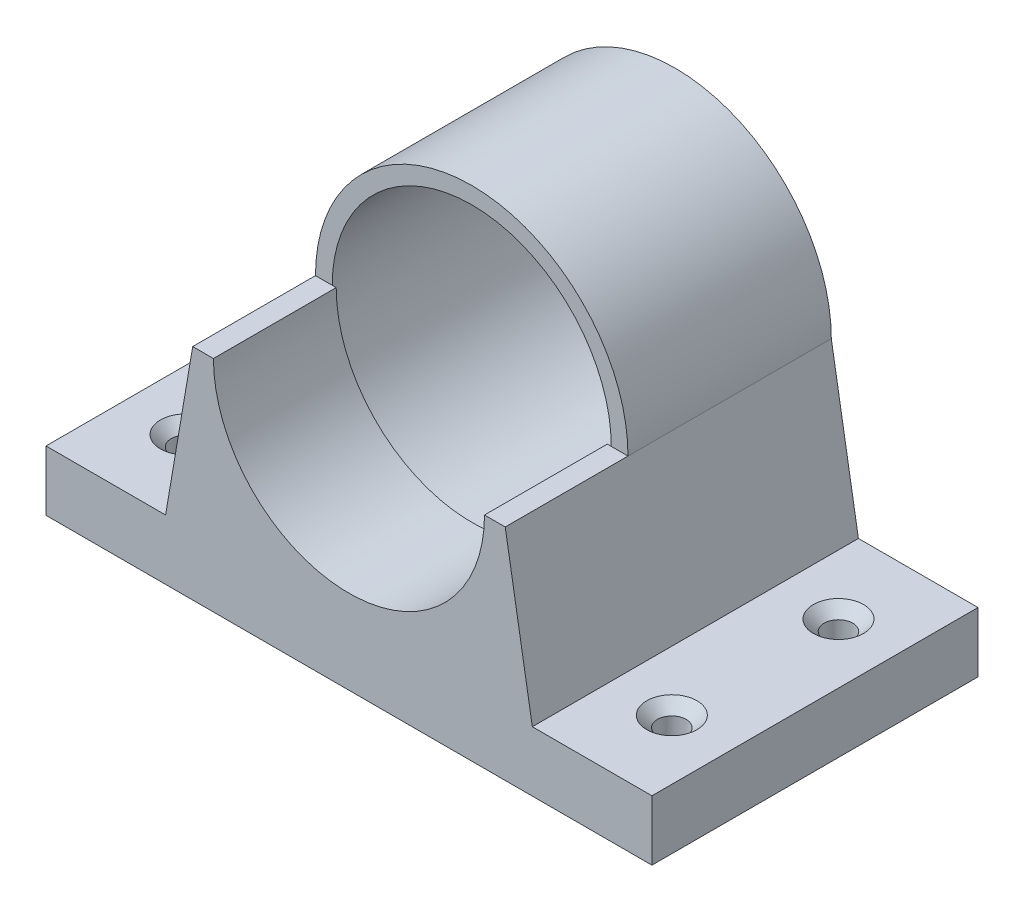
ISO-10303-21;
HEADER;
FILE_DESCRIPTION(('STEP AP214'),'2;1');
FILE_NAME('part.step','',(''),(''),'','','');
FILE_SCHEMA(('AUTOMOTIVE_DESIGN { 1 0 10303 214 1 1 1 1 }'));
ENDSEC;
DATA;
#1=APPLICATION_CONTEXT('core data for automotive mechanical design processes');
#2=APPLICATION_PROTOCOL_DEFINITION('international standard','automotive_design',2000,#1);
#3=PRODUCT_CONTEXT('',#1,'mechanical');
#4=PRODUCT('Part','Part','',(#3));
#5=PRODUCT_RELATED_PRODUCT_CATEGORY('part','',(#4));
#6=PRODUCT_DEFINITION_FORMATION('','',#4);
#7=PRODUCT_DEFINITION_CONTEXT('part definition',#1,'design');
#8=PRODUCT_DEFINITION('design','',#6,#7);
#9=PRODUCT_DEFINITION_SHAPE('','',#8);
#10=(LENGTH_UNIT() NAMED_UNIT(*) SI_UNIT(.MILLI.,.METRE.));
#11=(NAMED_UNIT(*) PLANE_ANGLE_UNIT() SI_UNIT($,.RADIAN.));
#12=(NAMED_UNIT(*) SI_UNIT($,.STERADIAN.) SOLID_ANGLE_UNIT());
#13=UNCERTAINTY_MEASURE_WITH_UNIT(LENGTH_MEASURE(1.E-05),#10,'distance_accuracy_value','');
#14=(GEOMETRIC_REPRESENTATION_CONTEXT(3) GLOBAL_UNCERTAINTY_ASSIGNED_CONTEXT((#13)) GLOBAL_UNIT_ASSIGNED_CONTEXT((#10,
#11,#12)) REPRESENTATION_CONTEXT('',''));
#15=CARTESIAN_POINT('',(0.,0.,0.));
#16=DIRECTION('',(0.,0.,1.));
#17=DIRECTION('',(1.,0.,0.));
#18=AXIS2_PLACEMENT_3D('',#15,#16,#17);
#19=CARTESIAN_POINT('',(0.,18.1533956791324,0.));
#20=DIRECTION('',(0.,0.,-1.));
#21=DIRECTION('',(-1.,0.,0.));
#22=AXIS2_PLACEMENT_3D('',#19,#20,#21);
#23=PLANE('',#22);
#24=CARTESIAN_POINT('',(0.,18.1533956791324,0.));
#25=DIRECTION('',(0.,0.,1.));
#26=DIRECTION('',(1.,0.,0.));
#27=AXIS2_PLACEMENT_3D('',#24,#25,#26);
#28=CIRCLE('',#27,17.5);
#29=CARTESIAN_POINT('',(17.5,18.1533956791324,0.));
#30=VERTEX_POINT('',#29);
#31=CARTESIAN_POINT('',(-17.5,18.1533956791324,0.));
#32=VERTEX_POINT('',#31);
#33=EDGE_CURVE('E332',#30,#32,#28,.T.);
#34=ORIENTED_EDGE('',*,*,#33,.F.);
#35=DIRECTION('',(1.,0.,0.));
#36=VECTOR('',#35,1.);
#37=CARTESIAN_POINT('',(0.,18.1533956791324,0.));
#38=LINE('',#37,#36);
#39=CARTESIAN_POINT('',(19.6,18.1533956791324,0.));
#40=VERTEX_POINT('',#39);
#41=EDGE_CURVE('E210',#30,#40,#38,.T.);
#42=ORIENTED_EDGE('',*,*,#41,.T.);
#43=CARTESIAN_POINT('',(0.,18.1533956791324,0.));
#44=DIRECTION('',(0.,0.,1.));
#45=DIRECTION('',(1.,0.,0.));
#46=AXIS2_PLACEMENT_3D('',#43,#44,#45);
#47=CIRCLE('',#46,19.6);
#48=CARTESIAN_POINT('',(-19.6,18.1533956791324,0.));
#49=VERTEX_POINT('',#48);
#50=EDGE_CURVE('E353',#40,#49,#47,.T.);
#51=ORIENTED_EDGE('',*,*,#50,.T.);
#52=DIRECTION('',(1.,0.,0.));
#53=VECTOR('',#52,1.);
#54=CARTESIAN_POINT('',(0.,18.1533956791324,0.));
#55=LINE('',#54,#53);
#56=EDGE_CURVE('E216',#49,#32,#55,.T.);
#57=ORIENTED_EDGE('',*,*,#56,.T.);
#58=EDGE_LOOP('',(#34,#42,#51,#57));
#59=FACE_BOUND('',#58,.T.);
#60=ADVANCED_FACE('F56',(#59),#23,.F.);
#61=CARTESIAN_POINT('',(0.,18.1533956791324,-25.5));
#62=DIRECTION('',(0.,0.,1.));
#63=DIRECTION('',(1.,0.,0.));
#64=AXIS2_PLACEMENT_3D('',#61,#62,#63);
#65=CYLINDRICAL_SURFACE('',#64,19.6);
#66=DIRECTION('',(0.,0.,-1.));
#67=VECTOR('',#66,1.);
#68=CARTESIAN_POINT('',(-19.6,18.1533956791324,15.4));
#69=LINE('',#68,#67);
#70=CARTESIAN_POINT('',(-19.6,18.1533956791324,-25.5));
#71=VERTEX_POINT('',#70);
#72=EDGE_CURVE('E333',#49,#71,#69,.T.);
#73=ORIENTED_EDGE('',*,*,#72,.F.);
#74=ORIENTED_EDGE('',*,*,#50,.F.);
#75=DIRECTION('',(0.,0.,-1.));
#76=VECTOR('',#75,1.);
#77=CARTESIAN_POINT('',(19.6,18.1533956791324,15.4));
#78=LINE('',#77,#76);
#79=CARTESIAN_POINT('',(19.6,18.1533956791324,-25.5));
#80=VERTEX_POINT('',#79);
#81=EDGE_CURVE('E328',#40,#80,#78,.T.);
#82=ORIENTED_EDGE('',*,*,#81,.T.);
#83=CARTESIAN_POINT('',(0.,18.1533956791324,-25.5));
#84=DIRECTION('',(0.,0.,-1.));
#85=DIRECTION('',(-1.,0.,0.));
#86=AXIS2_PLACEMENT_3D('',#83,#84,#85);
#87=CIRCLE('',#86,19.6);
#88=EDGE_CURVE('E357',#71,#80,#87,.T.);
#89=ORIENTED_EDGE('',*,*,#88,.F.);
#90=EDGE_LOOP('',(#73,#74,#82,#89));
#91=FACE_BOUND('',#90,.T.);
#92=ADVANCED_FACE('F58',(#91),#65,.T.);
#93=CARTESIAN_POINT('',(0.,18.1533956791324,-25.5));
#94=DIRECTION('',(0.,0.,-1.));
#95=DIRECTION('',(-1.,0.,0.));
#96=AXIS2_PLACEMENT_3D('',#93,#94,#95);
#97=PLANE('',#96);
#98=CARTESIAN_POINT('',(0.,18.1533956791324,-25.5));
#99=DIRECTION('',(0.,0.,1.));
#100=DIRECTION('',(1.,0.,0.));
#101=AXIS2_PLACEMENT_3D('',#98,#99,#100);
#102=CIRCLE('',#101,17.5);
#103=CARTESIAN_POINT('',(17.5,18.1533956791324,-25.5));
#104=VERTEX_POINT('',#103);
#105=EDGE_CURVE('E349',#104,#104,#102,.T.);
#106=ORIENTED_EDGE('',*,*,#105,.T.);
#107=EDGE_LOOP('',(#106));
#108=FACE_BOUND('',#107,.T.);
#109=ORIENTED_EDGE('',*,*,#88,.T.);
#110=DIRECTION('',(0.167595493933869,-0.985855846669817,0.));
#111=VECTOR('',#110,1.);
#112=CARTESIAN_POINT('',(19.6,18.1533956791324,-25.5));
#113=LINE('',#112,#111);
#114=CARTESIAN_POINT('',(23.,-1.84660432086758,-25.5));
#115=VERTEX_POINT('',#114);
#116=EDGE_CURVE('E293',#80,#115,#113,.T.);
#117=ORIENTED_EDGE('',*,*,#116,.T.);
#118=DIRECTION('',(1.,0.,0.));
#119=VECTOR('',#118,1.);
#120=CARTESIAN_POINT('',(23.,-1.84660432086758,-25.5));
#121=LINE('',#120,#119);
#122=CARTESIAN_POINT('',(38.,-1.84660432086758,-25.5));
#123=VERTEX_POINT('',#122);
#124=EDGE_CURVE('E297',#115,#123,#121,.T.);
#125=ORIENTED_EDGE('',*,*,#124,.T.);
#126=DIRECTION('',(0.,-1.,0.));
#127=VECTOR('',#126,1.);
#128=CARTESIAN_POINT('',(38.,-1.84660432086758,-25.5));
#129=LINE('',#128,#127);
#130=CARTESIAN_POINT('',(38.,-9.38660432086758,-25.5));
#131=VERTEX_POINT('',#130);
#132=EDGE_CURVE('E173',#123,#131,#129,.T.);
#133=ORIENTED_EDGE('',*,*,#132,.T.);
#134=DIRECTION('',(1.,0.,0.));
#135=VECTOR('',#134,1.);
#136=CARTESIAN_POINT('',(-38.,-9.38660432086758,-25.5));
#137=LINE('',#136,#135);
#138=CARTESIAN_POINT('',(-38.,-9.38660432086758,-25.5));
#139=VERTEX_POINT('',#138);
#140=EDGE_CURVE('E176',#139,#131,#137,.T.);
#141=ORIENTED_EDGE('',*,*,#140,.F.);
#142=DIRECTION('',(0.,-1.,0.));
#143=VECTOR('',#142,1.);
#144=CARTESIAN_POINT('',(-38.,-1.84660432086758,-25.5));
#145=LINE('',#144,#143);
#146=CARTESIAN_POINT('',(-38.,-1.84660432086758,-25.5));
#147=VERTEX_POINT('',#146);
#148=EDGE_CURVE('E160',#147,#139,#145,.T.);
#149=ORIENTED_EDGE('',*,*,#148,.F.);
#150=DIRECTION('',(-1.,0.,0.));
#151=VECTOR('',#150,1.);
#152=CARTESIAN_POINT('',(-23.,-1.84660432086758,-25.5));
#153=LINE('',#152,#151);
#154=CARTESIAN_POINT('',(-23.,-1.84660432086758,-25.5));
#155=VERTEX_POINT('',#154);
#156=EDGE_CURVE('E172',#155,#147,#153,.T.);
#157=ORIENTED_EDGE('',*,*,#156,.F.);
#158=DIRECTION('',(0.167595493933869,0.985855846669817,0.));
#159=VECTOR('',#158,1.);
#160=CARTESIAN_POINT('',(-23.,-1.84660432086758,-25.5));
#161=LINE('',#160,#159);
#162=EDGE_CURVE('E304',#155,#71,#161,.T.);
#163=ORIENTED_EDGE('',*,*,#162,.T.);
#164=EDGE_LOOP('',(#109,#117,#125,#133,#141,#149,#157,#163));
#165=FACE_BOUND('',#164,.T.);
#166=ADVANCED_FACE('F178',(#108,#165),#97,.T.);
#167=CARTESIAN_POINT('',(0.,18.1533956791324,-25.5));
#168=DIRECTION('',(0.,0.,1.));
#169=DIRECTION('',(1.,0.,0.));
#170=AXIS2_PLACEMENT_3D('',#167,#168,#169);
#171=CYLINDRICAL_SURFACE('',#170,17.5);
#172=ORIENTED_EDGE('',*,*,#105,.F.);
#173=EDGE_LOOP('',(#172));
#174=FACE_BOUND('',#173,.T.);
#175=ORIENTED_EDGE('',*,*,#33,.T.);
#176=CARTESIAN_POINT('',(0.,18.1533956791324,0.));
#177=DIRECTION('',(0.,0.,1.));
#178=DIRECTION('',(1.,0.,0.));
#179=AXIS2_PLACEMENT_3D('',#176,#177,#178);
#180=CIRCLE('',#179,17.5);
#181=EDGE_CURVE('E241',#30,#32,#180,.F.);
#182=ORIENTED_EDGE('',*,*,#181,.F.);
#183=EDGE_LOOP('',(#175,#182));
#184=FACE_BOUND('',#183,.T.);
#185=ADVANCED_FACE('F396',(#174,#184),#171,.F.);
#186=CARTESIAN_POINT('',(-23.,-1.84660432086758,15.4));
#187=DIRECTION('',(-0.985855846669818,0.167595493933869,0.));
#188=DIRECTION('',(-0.167595493933869,-0.985855846669818,0.));
#189=AXIS2_PLACEMENT_3D('',#186,#187,#188);
#190=PLANE('',#189);
#191=CARTESIAN_POINT('',(-19.6,18.1533956791324,15.4));
#192=VERTEX_POINT('',#191);
#193=EDGE_CURVE('E329',#192,#49,#69,.T.);
#194=ORIENTED_EDGE('',*,*,#193,.T.);
#195=ORIENTED_EDGE('',*,*,#72,.T.);
#196=ORIENTED_EDGE('',*,*,#162,.F.);
#197=DIRECTION('',(0.,0.,-1.));
#198=VECTOR('',#197,1.);
#199=CARTESIAN_POINT('',(-23.,-1.84660432086758,15.4));
#200=LINE('',#199,#198);
#201=CARTESIAN_POINT('',(-23.,-1.84660432086758,15.4));
#202=VERTEX_POINT('',#201);
#203=EDGE_CURVE('E334',#202,#155,#200,.T.);
#204=ORIENTED_EDGE('',*,*,#203,.F.);
#205=DIRECTION('',(0.167595493933869,0.985855846669817,0.));
#206=VECTOR('',#205,1.);
#207=CARTESIAN_POINT('',(-23.,-1.84660432086758,15.4));
#208=LINE('',#207,#206);
#209=EDGE_CURVE('E325',#202,#192,#208,.T.);
#210=ORIENTED_EDGE('',*,*,#209,.T.);
#211=EDGE_LOOP('',(#194,#195,#196,#204,#210));
#212=FACE_BOUND('',#211,.T.);
#213=ADVANCED_FACE('F400',(#212),#190,.T.);
#214=CARTESIAN_POINT('',(-23.,-1.84660432086758,15.4));
#215=DIRECTION('',(0.,-1.,0.));
#216=DIRECTION('',(1.,0.,0.));
#217=AXIS2_PLACEMENT_3D('',#214,#215,#216);
#218=PLANE('',#217);
#219=CARTESIAN_POINT('',(-30.5,-1.84660432086758,-15.5));
#220=DIRECTION('',(0.,1.,0.));
#221=DIRECTION('',(0.,0.,1.));
#222=AXIS2_PLACEMENT_3D('',#219,#220,#221);
#223=CIRCLE('',#222,3.15);
#224=CARTESIAN_POINT('',(-30.5,-1.84660432086758,-12.35));
#225=VERTEX_POINT('',#224);
#226=EDGE_CURVE('E269',#225,#225,#223,.T.);
#227=ORIENTED_EDGE('',*,*,#226,.F.);
#228=EDGE_LOOP('',(#227));
#229=FACE_BOUND('',#228,.T.);
#230=CARTESIAN_POINT('',(-30.5,-1.84660432086758,5.4));
#231=DIRECTION('',(0.,1.,0.));
#232=DIRECTION('',(0.,0.,1.));
#233=AXIS2_PLACEMENT_3D('',#230,#231,#232);
#234=CIRCLE('',#233,3.15);
#235=CARTESIAN_POINT('',(-30.5,-1.84660432086758,8.55));
#236=VERTEX_POINT('',#235);
#237=EDGE_CURVE('E281',#236,#236,#234,.T.);
#238=ORIENTED_EDGE('',*,*,#237,.F.);
#239=EDGE_LOOP('',(#238));
#240=FACE_BOUND('',#239,.T.);
#241=ORIENTED_EDGE('',*,*,#203,.T.);
#242=ORIENTED_EDGE('',*,*,#156,.T.);
#243=DIRECTION('',(0.,0.,-1.));
#244=VECTOR('',#243,1.);
#245=CARTESIAN_POINT('',(-38.,-1.84660432086758,15.4));
#246=LINE('',#245,#244);
#247=CARTESIAN_POINT('',(-38.,-1.84660432086758,15.4));
#248=VERTEX_POINT('',#247);
#249=EDGE_CURVE('E167',#248,#147,#246,.T.);
#250=ORIENTED_EDGE('',*,*,#249,.F.);
#251=DIRECTION('',(-1.,0.,0.));
#252=VECTOR('',#251,1.);
#253=CARTESIAN_POINT('',(-23.,-1.84660432086758,15.4));
#254=LINE('',#253,#252);
#255=EDGE_CURVE('E322',#202,#248,#254,.T.);
#256=ORIENTED_EDGE('',*,*,#255,.F.);
#257=EDGE_LOOP('',(#241,#242,#250,#256));
#258=FACE_BOUND('',#257,.T.);
#259=ADVANCED_FACE('F417',(#229,#240,#258),#218,.F.);
#260=CARTESIAN_POINT('',(-38.,-1.84660432086758,15.4));
#261=DIRECTION('',(1.,0.,0.));
#262=DIRECTION('',(0.,0.,-1.));
#263=AXIS2_PLACEMENT_3D('',#260,#261,#262);
#264=PLANE('',#263);
#265=ORIENTED_EDGE('',*,*,#249,.T.);
#266=ORIENTED_EDGE('',*,*,#148,.T.);
#267=DIRECTION('',(0.,0.,-1.));
#268=VECTOR('',#267,1.);
#269=CARTESIAN_POINT('',(-38.,-9.38660432086758,15.4));
#270=LINE('',#269,#268);
#271=CARTESIAN_POINT('',(-38.,-9.38660432086758,15.4));
#272=VERTEX_POINT('',#271);
#273=EDGE_CURVE('E165',#272,#139,#270,.T.);
#274=ORIENTED_EDGE('',*,*,#273,.F.);
#275=DIRECTION('',(0.,-1.,0.));
#276=VECTOR('',#275,1.);
#277=CARTESIAN_POINT('',(-38.,-1.84660432086758,15.4));
#278=LINE('',#277,#276);
#279=EDGE_CURVE('E319',#248,#272,#278,.T.);
#280=ORIENTED_EDGE('',*,*,#279,.F.);
#281=EDGE_LOOP('',(#265,#266,#274,#280));
#282=FACE_BOUND('',#281,.T.);
#283=ADVANCED_FACE('F162',(#282),#264,.F.);
#284=CARTESIAN_POINT('',(38.,-1.84660432086758,15.4));
#285=DIRECTION('',(1.,0.,0.));
#286=DIRECTION('',(0.,0.,-1.));
#287=AXIS2_PLACEMENT_3D('',#284,#285,#286);
#288=PLANE('',#287);
#289=DIRECTION('',(0.,-1.,0.));
#290=VECTOR('',#289,1.);
#291=CARTESIAN_POINT('',(38.,-1.84660432086758,15.4));
#292=LINE('',#291,#290);
#293=CARTESIAN_POINT('',(38.,-1.84660432086758,15.4));
#294=VERTEX_POINT('',#293);
#295=CARTESIAN_POINT('',(38.,-9.38660432086758,15.4));
#296=VERTEX_POINT('',#295);
#297=EDGE_CURVE('E316',#294,#296,#292,.T.);
#298=ORIENTED_EDGE('',*,*,#297,.T.);
#299=DIRECTION('',(0.,0.,1.));
#300=VECTOR('',#299,1.);
#301=CARTESIAN_POINT('',(38.,-9.38660432086758,15.4));
#302=LINE('',#301,#300);
#303=EDGE_CURVE('E185',#131,#296,#302,.T.);
#304=ORIENTED_EDGE('',*,*,#303,.F.);
#305=ORIENTED_EDGE('',*,*,#132,.F.);
#306=DIRECTION('',(0.,0.,-1.));
#307=VECTOR('',#306,1.);
#308=CARTESIAN_POINT('',(38.,-1.84660432086758,15.4));
#309=LINE('',#308,#307);
#310=EDGE_CURVE('E339',#294,#123,#309,.T.);
#311=ORIENTED_EDGE('',*,*,#310,.F.);
#312=EDGE_LOOP('',(#298,#304,#305,#311));
#313=FACE_BOUND('',#312,.T.);
#314=ADVANCED_FACE('F410',(#313),#288,.T.);
#315=CARTESIAN_POINT('',(23.,-1.84660432086758,15.4));
#316=DIRECTION('',(0.,1.,0.));
#317=DIRECTION('',(-1.,0.,0.));
#318=AXIS2_PLACEMENT_3D('',#315,#316,#317);
#319=PLANE('',#318);
#320=CARTESIAN_POINT('',(30.5,-1.84660432086758,5.4));
#321=DIRECTION('',(0.,1.,0.));
#322=DIRECTION('',(0.,0.,1.));
#323=AXIS2_PLACEMENT_3D('',#320,#321,#322);
#324=CIRCLE('',#323,3.15);
#325=CARTESIAN_POINT('',(30.5,-1.84660432086758,8.55));
#326=VERTEX_POINT('',#325);
#327=EDGE_CURVE('E245',#326,#326,#324,.T.);
#328=ORIENTED_EDGE('',*,*,#327,.F.);
#329=EDGE_LOOP('',(#328));
#330=FACE_BOUND('',#329,.T.);
#331=CARTESIAN_POINT('',(30.5,-1.84660432086758,-15.5));
#332=DIRECTION('',(0.,1.,0.));
#333=DIRECTION('',(0.,0.,1.));
#334=AXIS2_PLACEMENT_3D('',#331,#332,#333);
#335=CIRCLE('',#334,3.15);
#336=CARTESIAN_POINT('',(30.5,-1.84660432086758,-12.35));
#337=VERTEX_POINT('',#336);
#338=EDGE_CURVE('E257',#337,#337,#335,.T.);
#339=ORIENTED_EDGE('',*,*,#338,.F.);
#340=EDGE_LOOP('',(#339));
#341=FACE_BOUND('',#340,.T.);
#342=ORIENTED_EDGE('',*,*,#310,.T.);
#343=ORIENTED_EDGE('',*,*,#124,.F.);
#344=DIRECTION('',(0.,0.,-1.));
#345=VECTOR('',#344,1.);
#346=CARTESIAN_POINT('',(23.,-1.84660432086758,15.4));
#347=LINE('',#346,#345);
#348=CARTESIAN_POINT('',(23.,-1.84660432086758,15.4));
#349=VERTEX_POINT('',#348);
#350=EDGE_CURVE('E342',#349,#115,#347,.T.);
#351=ORIENTED_EDGE('',*,*,#350,.F.);
#352=DIRECTION('',(1.,0.,0.));
#353=VECTOR('',#352,1.);
#354=CARTESIAN_POINT('',(23.,-1.84660432086758,15.4));
#355=LINE('',#354,#353);
#356=EDGE_CURVE('E312',#349,#294,#355,.T.);
#357=ORIENTED_EDGE('',*,*,#356,.T.);
#358=EDGE_LOOP('',(#342,#343,#351,#357));
#359=FACE_BOUND('',#358,.T.);
#360=ADVANCED_FACE('F406',(#330,#341,#359),#319,.T.);
#361=CARTESIAN_POINT('',(19.6,18.1533956791324,15.4));
#362=DIRECTION('',(0.985855846669818,0.167595493933869,0.));
#363=DIRECTION('',(-0.167595493933869,0.985855846669818,0.));
#364=AXIS2_PLACEMENT_3D('',#361,#362,#363);
#365=PLANE('',#364);
#366=ORIENTED_EDGE('',*,*,#350,.T.);
#367=ORIENTED_EDGE('',*,*,#116,.F.);
#368=ORIENTED_EDGE('',*,*,#81,.F.);
#369=CARTESIAN_POINT('',(19.6,18.1533956791324,15.4));
#370=VERTEX_POINT('',#369);
#371=EDGE_CURVE('E345',#370,#40,#78,.T.);
#372=ORIENTED_EDGE('',*,*,#371,.F.);
#373=DIRECTION('',(0.167595493933869,-0.985855846669817,0.));
#374=VECTOR('',#373,1.);
#375=CARTESIAN_POINT('',(19.6,18.1533956791324,15.4));
#376=LINE('',#375,#374);
#377=EDGE_CURVE('E308',#370,#349,#376,.T.);
#378=ORIENTED_EDGE('',*,*,#377,.T.);
#379=EDGE_LOOP('',(#366,#367,#368,#372,#378));
#380=FACE_BOUND('',#379,.T.);
#381=ADVANCED_FACE('F402',(#380),#365,.T.);
#382=CARTESIAN_POINT('',(0.,18.1533956791324,15.4));
#383=DIRECTION('',(0.,0.,1.));
#384=DIRECTION('',(1.,0.,0.));
#385=AXIS2_PLACEMENT_3D('',#382,#383,#384);
#386=PLANE('',#385);
#387=ORIENTED_EDGE('',*,*,#377,.F.);
#388=DIRECTION('',(1.,0.,0.));
#389=VECTOR('',#388,1.);
#390=CARTESIAN_POINT('',(0.,18.1533956791324,15.4));
#391=LINE('',#390,#389);
#392=CARTESIAN_POINT('',(17.,18.1533956791324,15.4));
#393=VERTEX_POINT('',#392);
#394=EDGE_CURVE('E211',#393,#370,#391,.T.);
#395=ORIENTED_EDGE('',*,*,#394,.F.);
#396=CARTESIAN_POINT('',(0.,18.1533956791324,15.4));
#397=DIRECTION('',(0.,0.,1.));
#398=DIRECTION('',(1.,0.,0.));
#399=AXIS2_PLACEMENT_3D('',#396,#397,#398);
#400=CIRCLE('',#399,17.);
#401=CARTESIAN_POINT('',(-17.,18.1533956791324,15.4));
#402=VERTEX_POINT('',#401);
#403=EDGE_CURVE('E215',#393,#402,#400,.F.);
#404=ORIENTED_EDGE('',*,*,#403,.T.);
#405=DIRECTION('',(1.,0.,0.));
#406=VECTOR('',#405,1.);
#407=CARTESIAN_POINT('',(0.,18.1533956791324,15.4));
#408=LINE('',#407,#406);
#409=EDGE_CURVE('E219',#192,#402,#408,.T.);
#410=ORIENTED_EDGE('',*,*,#409,.F.);
#411=ORIENTED_EDGE('',*,*,#209,.F.);
#412=ORIENTED_EDGE('',*,*,#255,.T.);
#413=ORIENTED_EDGE('',*,*,#279,.T.);
#414=DIRECTION('',(-1.,0.,0.));
#415=VECTOR('',#414,1.);
#416=CARTESIAN_POINT('',(-38.,-9.38660432086758,15.4));
#417=LINE('',#416,#415);
#418=EDGE_CURVE('E190',#296,#272,#417,.T.);
#419=ORIENTED_EDGE('',*,*,#418,.F.);
#420=ORIENTED_EDGE('',*,*,#297,.F.);
#421=ORIENTED_EDGE('',*,*,#356,.F.);
#422=EDGE_LOOP('',(#387,#395,#404,#410,#411,#412,#413,#419,#420,#421));
#423=FACE_BOUND('',#422,.T.);
#424=ADVANCED_FACE('F405',(#423),#386,.T.);
#425=CARTESIAN_POINT('',(-30.5,-1.84660432086758,5.4));
#426=DIRECTION('',(0.,1.,0.));
#427=DIRECTION('',(0.,0.,1.));
#428=AXIS2_PLACEMENT_3D('',#425,#426,#427);
#429=CYLINDRICAL_SURFACE('',#428,1.8);
#430=CARTESIAN_POINT('',(-30.5,-6.8466043208676,5.4));
#431=DIRECTION('',(0.,1.,0.));
#432=DIRECTION('',(0.,0.,1.));
#433=AXIS2_PLACEMENT_3D('',#430,#431,#432);
#434=CIRCLE('',#433,1.8);
#435=CARTESIAN_POINT('',(-31.1501324707505,-6.84660432086758,7.0784905994204));
#436=VERTEX_POINT('',#435);
#437=CARTESIAN_POINT('',(-31.2346383830945,-6.8466043208676,3.75673908155633));
#438=VERTEX_POINT('',#437);
#439=EDGE_CURVE('E289',#436,#438,#434,.T.);
#440=ORIENTED_EDGE('',*,*,#439,.F.);
#441=CARTESIAN_POINT('',(-30.5,-6.87162560958618,5.4));
#442=DIRECTION('',(0.0360908865319125,0.999348089954104,-0.000918158169658168));
#443=DIRECTION('',(-0.999024856761494,0.0361025636912934,0.0254153588916714));
#444=AXIS2_PLACEMENT_3D('',#441,#442,#443);
#445=ELLIPSE('',#444,1.80117420355771,1.8);
#446=EDGE_CURVE('E12',#436,#438,#445,.F.);
#447=ORIENTED_EDGE('',*,*,#446,.T.);
#448=EDGE_LOOP('',(#440,#447));
#449=FACE_BOUND('',#448,.T.);
#450=CARTESIAN_POINT('',(-30.5,-3.19660432086758,5.4));
#451=DIRECTION('',(0.,1.,0.));
#452=DIRECTION('',(0.,0.,1.));
#453=AXIS2_PLACEMENT_3D('',#450,#451,#452);
#454=CIRCLE('',#453,1.8);
#455=CARTESIAN_POINT('',(-30.5,-3.19660432086758,7.2));
#456=VERTEX_POINT('',#455);
#457=EDGE_CURVE('E285',#456,#456,#454,.T.);
#458=ORIENTED_EDGE('',*,*,#457,.T.);
#459=EDGE_LOOP('',(#458));
#460=FACE_BOUND('',#459,.T.);
#461=ADVANCED_FACE('F426',(#449,#460),#429,.F.);
#462=CARTESIAN_POINT('',(-30.5,-1.84660432086758,5.4));
#463=DIRECTION('',(0.,1.,0.));
#464=DIRECTION('',(0.,0.,1.));
#465=AXIS2_PLACEMENT_3D('',#462,#463,#464);
#466=CONICAL_SURFACE('',#465,3.15,0.785398163397448);
#467=ORIENTED_EDGE('',*,*,#457,.F.);
#468=EDGE_LOOP('',(#467));
#469=FACE_BOUND('',#468,.T.);
#470=ORIENTED_EDGE('',*,*,#237,.T.);
#471=EDGE_LOOP('',(#470));
#472=FACE_BOUND('',#471,.T.);
#473=ADVANCED_FACE('F430',(#469,#472),#466,.F.);
#474=CARTESIAN_POINT('',(-30.5,-1.84660432086758,-15.5));
#475=DIRECTION('',(0.,1.,0.));
#476=DIRECTION('',(0.,0.,1.));
#477=AXIS2_PLACEMENT_3D('',#474,#475,#476);
#478=CYLINDRICAL_SURFACE('',#477,1.8);
#479=CARTESIAN_POINT('',(-30.5,-6.8466043208676,-15.5));
#480=DIRECTION('',(0.,1.,0.));
#481=DIRECTION('',(0.,0.,1.));
#482=AXIS2_PLACEMENT_3D('',#479,#480,#481);
#483=CIRCLE('',#482,1.8);
#484=CARTESIAN_POINT('',(-31.6901796266715,-6.84660432086758,-14.1496390086658));
#485=VERTEX_POINT('',#484);
#486=CARTESIAN_POINT('',(-31.7573024059841,-6.8466043208676,-16.7880957495103));
#487=VERTEX_POINT('',#486);
#488=EDGE_CURVE('E277',#485,#487,#483,.T.);
#489=ORIENTED_EDGE('',*,*,#488,.F.);
#490=CARTESIAN_POINT('',(-30.5,-6.89082763332421,-15.5));
#491=DIRECTION('',(0.0360908865319125,0.999348089954104,-0.000918158169658168));
#492=DIRECTION('',(-0.999024856761494,0.0361025636912934,0.0254153588916714));
#493=AXIS2_PLACEMENT_3D('',#490,#491,#492);
#494=ELLIPSE('',#493,1.80117420355771,1.8);
#495=EDGE_CURVE('E65',#485,#487,#494,.F.);
#496=ORIENTED_EDGE('',*,*,#495,.T.);
#497=EDGE_LOOP('',(#489,#496));
#498=FACE_BOUND('',#497,.T.);
#499=CARTESIAN_POINT('',(-30.5,-3.19660432086758,-15.5));
#500=DIRECTION('',(0.,1.,0.));
#501=DIRECTION('',(0.,0.,1.));
#502=AXIS2_PLACEMENT_3D('',#499,#500,#501);
#503=CIRCLE('',#502,1.8);
#504=CARTESIAN_POINT('',(-30.5,-3.19660432086758,-13.7));
#505=VERTEX_POINT('',#504);
#506=EDGE_CURVE('E273',#505,#505,#503,.T.);
#507=ORIENTED_EDGE('',*,*,#506,.T.);
#508=EDGE_LOOP('',(#507));
#509=FACE_BOUND('',#508,.T.);
#510=ADVANCED_FACE('F365',(#498,#509),#478,.F.);
#511=CARTESIAN_POINT('',(-30.5,-1.84660432086758,-15.5));
#512=DIRECTION('',(0.,1.,0.));
#513=DIRECTION('',(0.,0.,1.));
#514=AXIS2_PLACEMENT_3D('',#511,#512,#513);
#515=CONICAL_SURFACE('',#514,3.15,0.785398163397448);
#516=ORIENTED_EDGE('',*,*,#506,.F.);
#517=EDGE_LOOP('',(#516));
#518=FACE_BOUND('',#517,.T.);
#519=ORIENTED_EDGE('',*,*,#226,.T.);
#520=EDGE_LOOP('',(#519));
#521=FACE_BOUND('',#520,.T.);
#522=ADVANCED_FACE('F436',(#518,#521),#515,.F.);
#523=CARTESIAN_POINT('',(30.5,-1.84660432086758,-15.5));
#524=DIRECTION('',(0.,1.,0.));
#525=DIRECTION('',(0.,0.,1.));
#526=AXIS2_PLACEMENT_3D('',#523,#524,#525);
#527=CYLINDRICAL_SURFACE('',#526,1.79999999999999);
#528=CARTESIAN_POINT('',(30.5,-6.84660432086761,-15.5));
#529=DIRECTION('',(0.,1.,0.));
#530=DIRECTION('',(0.,0.,1.));
#531=AXIS2_PLACEMENT_3D('',#528,#529,#530);
#532=CIRCLE('',#531,1.8);
#533=CARTESIAN_POINT('',(30.5,-6.84660432086761,-13.7));
#534=VERTEX_POINT('',#533);
#535=EDGE_CURVE('E265',#534,#534,#532,.T.);
#536=ORIENTED_EDGE('',*,*,#535,.F.);
#537=EDGE_LOOP('',(#536));
#538=FACE_BOUND('',#537,.T.);
#539=CARTESIAN_POINT('',(30.5,-3.19660432086759,-15.5));
#540=DIRECTION('',(0.,1.,0.));
#541=DIRECTION('',(0.,0.,1.));
#542=AXIS2_PLACEMENT_3D('',#539,#540,#541);
#543=CIRCLE('',#542,1.79999999999999);
#544=CARTESIAN_POINT('',(30.5,-3.19660432086759,-13.7));
#545=VERTEX_POINT('',#544);
#546=EDGE_CURVE('E261',#545,#545,#543,.T.);
#547=ORIENTED_EDGE('',*,*,#546,.T.);
#548=EDGE_LOOP('',(#547));
#549=FACE_BOUND('',#548,.T.);
#550=ADVANCED_FACE('F439',(#538,#549),#527,.F.);
#551=CARTESIAN_POINT('',(30.5,-1.84660432086758,-15.5));
#552=DIRECTION('',(0.,1.,0.));
#553=DIRECTION('',(0.,0.,1.));
#554=AXIS2_PLACEMENT_3D('',#551,#552,#553);
#555=CONICAL_SURFACE('',#554,3.15,0.78539816339745);
#556=ORIENTED_EDGE('',*,*,#546,.F.);
#557=EDGE_LOOP('',(#556));
#558=FACE_BOUND('',#557,.T.);
#559=ORIENTED_EDGE('',*,*,#338,.T.);
#560=EDGE_LOOP('',(#559));
#561=FACE_BOUND('',#560,.T.);
#562=ADVANCED_FACE('F443',(#558,#561),#555,.F.);
#563=CARTESIAN_POINT('',(30.5,-1.84660432086758,5.4));
#564=DIRECTION('',(0.,1.,0.));
#565=DIRECTION('',(0.,0.,1.));
#566=AXIS2_PLACEMENT_3D('',#563,#564,#565);
#567=CYLINDRICAL_SURFACE('',#566,1.79999999999999);
#568=CARTESIAN_POINT('',(30.5,-6.84660432086761,5.4));
#569=DIRECTION('',(0.,1.,0.));
#570=DIRECTION('',(0.,0.,1.));
#571=AXIS2_PLACEMENT_3D('',#568,#569,#570);
#572=CIRCLE('',#571,1.8);
#573=CARTESIAN_POINT('',(30.5,-6.84660432086761,7.2));
#574=VERTEX_POINT('',#573);
#575=EDGE_CURVE('E253',#574,#574,#572,.T.);
#576=ORIENTED_EDGE('',*,*,#575,.F.);
#577=EDGE_LOOP('',(#576));
#578=FACE_BOUND('',#577,.T.);
#579=CARTESIAN_POINT('',(30.5,-3.19660432086759,5.4));
#580=DIRECTION('',(0.,1.,0.));
#581=DIRECTION('',(0.,0.,1.));
#582=AXIS2_PLACEMENT_3D('',#579,#580,#581);
#583=CIRCLE('',#582,1.79999999999999);
#584=CARTESIAN_POINT('',(30.5,-3.19660432086759,7.19999999999998));
#585=VERTEX_POINT('',#584);
#586=EDGE_CURVE('E249',#585,#585,#583,.T.);
#587=ORIENTED_EDGE('',*,*,#586,.T.);
#588=EDGE_LOOP('',(#587));
#589=FACE_BOUND('',#588,.T.);
#590=ADVANCED_FACE('F447',(#578,#589),#567,.F.);
#591=CARTESIAN_POINT('',(30.5,-1.84660432086758,5.4));
#592=DIRECTION('',(0.,1.,0.));
#593=DIRECTION('',(0.,0.,1.));
#594=AXIS2_PLACEMENT_3D('',#591,#592,#593);
#595=CONICAL_SURFACE('',#594,3.15,0.785398163397453);
#596=ORIENTED_EDGE('',*,*,#586,.F.);
#597=EDGE_LOOP('',(#596));
#598=FACE_BOUND('',#597,.T.);
#599=ORIENTED_EDGE('',*,*,#327,.T.);
#600=EDGE_LOOP('',(#599));
#601=FACE_BOUND('',#600,.T.);
#602=ADVANCED_FACE('F451',(#598,#601),#595,.F.);
#603=CARTESIAN_POINT('',(0.,0.,0.));
#604=DIRECTION('',(0.,0.,1.));
#605=DIRECTION('',(1.,0.,0.));
#606=AXIS2_PLACEMENT_3D('',#603,#604,#605);
#607=PLANE('',#606);
#608=CARTESIAN_POINT('',(17.,18.1533956791324,0.));
#609=VERTEX_POINT('',#608);
#610=EDGE_CURVE('E224',#609,#30,#38,.T.);
#611=ORIENTED_EDGE('',*,*,#610,.T.);
#612=ORIENTED_EDGE('',*,*,#181,.T.);
#613=CARTESIAN_POINT('',(-17.,18.1533956791324,0.));
#614=VERTEX_POINT('',#613);
#615=EDGE_CURVE('E232',#32,#614,#55,.T.);
#616=ORIENTED_EDGE('',*,*,#615,.T.);
#617=CARTESIAN_POINT('',(0.,18.1533956791324,0.));
#618=DIRECTION('',(0.,0.,1.));
#619=DIRECTION('',(1.,0.,0.));
#620=AXIS2_PLACEMENT_3D('',#617,#618,#619);
#621=CIRCLE('',#620,17.);
#622=EDGE_CURVE('E228',#609,#614,#621,.F.);
#623=ORIENTED_EDGE('',*,*,#622,.F.);
#624=EDGE_LOOP('',(#611,#612,#616,#623));
#625=FACE_BOUND('',#624,.T.);
#626=ADVANCED_FACE('F455',(#625),#607,.F.);
#627=CARTESIAN_POINT('',(0.,18.1533956791324,15.4));
#628=DIRECTION('',(0.,1.,0.));
#629=DIRECTION('',(0.,0.,1.));
#630=AXIS2_PLACEMENT_3D('',#627,#628,#629);
#631=PLANE('',#630);
#632=ORIENTED_EDGE('',*,*,#610,.F.);
#633=DIRECTION('',(0.,0.,-1.));
#634=VECTOR('',#633,1.);
#635=CARTESIAN_POINT('',(17.,18.1533956791324,15.4));
#636=LINE('',#635,#634);
#637=EDGE_CURVE('E238',#393,#609,#636,.T.);
#638=ORIENTED_EDGE('',*,*,#637,.F.);
#639=ORIENTED_EDGE('',*,*,#394,.T.);
#640=ORIENTED_EDGE('',*,*,#371,.T.);
#641=ORIENTED_EDGE('',*,*,#41,.F.);
#642=EDGE_LOOP('',(#632,#638,#639,#640,#641));
#643=FACE_BOUND('',#642,.T.);
#644=ADVANCED_FACE('F457',(#643),#631,.T.);
#645=CARTESIAN_POINT('',(0.,18.1533956791324,15.4));
#646=DIRECTION('',(0.,0.,-1.));
#647=DIRECTION('',(-1.,0.,0.));
#648=AXIS2_PLACEMENT_3D('',#645,#646,#647);
#649=CYLINDRICAL_SURFACE('',#648,17.);
#650=ORIENTED_EDGE('',*,*,#622,.T.);
#651=DIRECTION('',(0.,0.,-1.));
#652=VECTOR('',#651,1.);
#653=CARTESIAN_POINT('',(-17.,18.1533956791324,15.4));
#654=LINE('',#653,#652);
#655=EDGE_CURVE('E223',#402,#614,#654,.T.);
#656=ORIENTED_EDGE('',*,*,#655,.F.);
#657=ORIENTED_EDGE('',*,*,#403,.F.);
#658=ORIENTED_EDGE('',*,*,#637,.T.);
#659=EDGE_LOOP('',(#650,#656,#657,#658));
#660=FACE_BOUND('',#659,.T.);
#661=ADVANCED_FACE('F382',(#660),#649,.F.);
#662=CARTESIAN_POINT('',(0.,18.1533956791324,15.4));
#663=DIRECTION('',(0.,1.,0.));
#664=DIRECTION('',(0.,0.,1.));
#665=AXIS2_PLACEMENT_3D('',#662,#663,#664);
#666=PLANE('',#665);
#667=ORIENTED_EDGE('',*,*,#56,.F.);
#668=ORIENTED_EDGE('',*,*,#193,.F.);
#669=ORIENTED_EDGE('',*,*,#409,.T.);
#670=ORIENTED_EDGE('',*,*,#655,.T.);
#671=ORIENTED_EDGE('',*,*,#615,.F.);
#672=EDGE_LOOP('',(#667,#668,#669,#670,#671));
#673=FACE_BOUND('',#672,.T.);
#674=ADVANCED_FACE('F373',(#673),#666,.T.);
#675=CARTESIAN_POINT('',(-33.3046036567594,-16.713113562191,-15.4286504154495));
#676=DIRECTION('',(0.0360908865319125,0.999348089954104,-0.000918158169658168));
#677=DIRECTION('',(-0.999348511186798,0.0360909017444911,0.));
#678=AXIS2_PLACEMENT_3D('',#675,#676,#677);
#679=CYLINDRICAL_SURFACE('',#678,1.79999999999999);
#680=CARTESIAN_POINT('',(-32.946684241995,-6.80240983963142,-15.4377559450256));
#681=DIRECTION('',(0.0360908865319125,0.999348089954104,-0.000918158169658168));
#682=DIRECTION('',(-0.999348511186798,0.0360909017444911,0.));
#683=AXIS2_PLACEMENT_3D('',#680,#681,#682);
#684=CIRCLE('',#683,1.79999999999999);
#685=EDGE_CURVE('E78',#487,#485,#684,.T.);
#686=ORIENTED_EDGE('',*,*,#685,.T.);
#687=CARTESIAN_POINT('',(-32.9482803004892,-6.84660432086758,-15.4377153410314));
#688=DIRECTION('',(0.,1.,0.));
#689=DIRECTION('',(0.999676555950965,0.,-0.0254319382276887));
#690=AXIS2_PLACEMENT_3D('',#687,#688,#689);
#691=ELLIPSE('',#690,1.80117420355769,1.79999999999999);
#692=EDGE_CURVE('E200',#487,#485,#691,.T.);
#693=ORIENTED_EDGE('',*,*,#692,.F.);
#694=EDGE_LOOP('',(#686,#693));
#695=FACE_BOUND('',#694,.T.);
#696=ADVANCED_FACE('F370',(#695),#679,.F.);
#697=CARTESIAN_POINT('',(-32.946684241995,-6.80240983963142,-15.4377559450256));
#698=DIRECTION('',(0.0360908865319125,0.999348089954104,-0.000918158169658168));
#699=DIRECTION('',(-0.999348511186798,0.0360909017444911,0.));
#700=AXIS2_PLACEMENT_3D('',#697,#698,#699);
#701=PLANE('',#700);
#702=ORIENTED_EDGE('',*,*,#685,.F.);
#703=ORIENTED_EDGE('',*,*,#495,.F.);
#704=EDGE_LOOP('',(#702,#703));
#705=FACE_BOUND('',#704,.T.);
#706=ADVANCED_FACE('F372',(#705),#701,.F.);
#707=CARTESIAN_POINT('',(-32.2422388737082,-16.7323030679368,5.4443228473754));
#708=DIRECTION('',(0.0360908865319125,0.999348089954104,-0.000918158169658168));
#709=DIRECTION('',(-0.999348511186798,0.0360909017444911,0.));
#710=AXIS2_PLACEMENT_3D('',#707,#708,#709);
#711=CYLINDRICAL_SURFACE('',#710,1.8);
#712=CARTESIAN_POINT('',(-31.8843194589438,-6.82159934537727,5.43521731779926));
#713=DIRECTION('',(0.0360908865319125,0.999348089954104,-0.000918158169658168));
#714=DIRECTION('',(-0.999348511186798,0.0360909017444911,0.));
#715=AXIS2_PLACEMENT_3D('',#712,#713,#714);
#716=CIRCLE('',#715,1.8);
#717=EDGE_CURVE('E71',#438,#436,#716,.T.);
#718=ORIENTED_EDGE('',*,*,#717,.T.);
#719=CARTESIAN_POINT('',(-31.885222499378,-6.84660432086758,5.43524029129845));
#720=DIRECTION('',(0.,1.,0.));
#721=DIRECTION('',(0.999676555950965,0.,-0.0254319382276887));
#722=AXIS2_PLACEMENT_3D('',#719,#720,#721);
#723=ELLIPSE('',#722,1.80117420355771,1.8);
#724=EDGE_CURVE('E206',#438,#436,#723,.T.);
#725=ORIENTED_EDGE('',*,*,#724,.F.);
#726=EDGE_LOOP('',(#718,#725));
#727=FACE_BOUND('',#726,.T.);
#728=ADVANCED_FACE('F379',(#727),#711,.F.);
#729=CARTESIAN_POINT('',(-31.8843194589438,-6.82159934537727,5.43521731779926));
#730=DIRECTION('',(0.0360908865319125,0.999348089954104,-0.000918158169658168));
#731=DIRECTION('',(-0.999348511186798,0.0360909017444911,0.));
#732=AXIS2_PLACEMENT_3D('',#729,#730,#731);
#733=PLANE('',#732);
#734=ORIENTED_EDGE('',*,*,#717,.F.);
#735=ORIENTED_EDGE('',*,*,#446,.F.);
#736=EDGE_LOOP('',(#734,#735));
#737=FACE_BOUND('',#736,.T.);
#738=ADVANCED_FACE('F467',(#737),#733,.F.);
#739=CARTESIAN_POINT('',(0.,-6.84660432086758,0.));
#740=DIRECTION('',(0.,-1.,0.));
#741=DIRECTION('',(0.,0.,-1.));
#742=AXIS2_PLACEMENT_3D('',#739,#740,#741);
#743=PLANE('',#742);
#744=ORIENTED_EDGE('',*,*,#724,.T.);
#745=ORIENTED_EDGE('',*,*,#439,.T.);
#746=EDGE_LOOP('',(#744,#745));
#747=FACE_BOUND('',#746,.T.);
#748=ADVANCED_FACE('F470',(#747),#743,.F.);
#749=ORIENTED_EDGE('',*,*,#692,.T.);
#750=ORIENTED_EDGE('',*,*,#488,.T.);
#751=EDGE_LOOP('',(#749,#750));
#752=FACE_BOUND('',#751,.T.);
#753=ADVANCED_FACE('F368',(#752),#743,.F.);
#754=ORIENTED_EDGE('',*,*,#575,.T.);
#755=EDGE_LOOP('',(#754));
#756=FACE_BOUND('',#755,.T.);
#757=ADVANCED_FACE('F515',(#756),#743,.F.);
#758=ORIENTED_EDGE('',*,*,#535,.T.);
#759=EDGE_LOOP('',(#758));
#760=FACE_BOUND('',#759,.T.);
#761=ADVANCED_FACE('F511',(#760),#743,.F.);
#762=CARTESIAN_POINT('',(0.,-9.38660432086758,0.));
#763=DIRECTION('',(0.,-1.,0.));
#764=DIRECTION('',(0.,0.,-1.));
#765=AXIS2_PLACEMENT_3D('',#762,#763,#764);
#766=PLANE('',#765);
#767=ORIENTED_EDGE('',*,*,#273,.T.);
#768=ORIENTED_EDGE('',*,*,#140,.T.);
#769=ORIENTED_EDGE('',*,*,#303,.T.);
#770=ORIENTED_EDGE('',*,*,#418,.T.);
#771=EDGE_LOOP('',(#767,#768,#769,#770));
#772=FACE_BOUND('',#771,.T.);
#773=ADVANCED_FACE('F188',(#772),#766,.T.);
#774=CLOSED_SHELL('',(#60,#92,#166,#185,#213,#259,#283,#314,#360,#381,#424,#461,#473,#510,#522,
#550,#562,#590,#602,#626,#644,#661,#674,#696,#706,#728,#738,#748,#753,#757,#761,#773));
#775=MANIFOLD_SOLID_BREP('B2',#774);
#776=ADVANCED_BREP_SHAPE_REPRESENTATION('',(#18,#775),#14);
#777=SHAPE_DEFINITION_REPRESENTATION(#9,#776);
ENDSEC;
END-ISO-10303-21;
